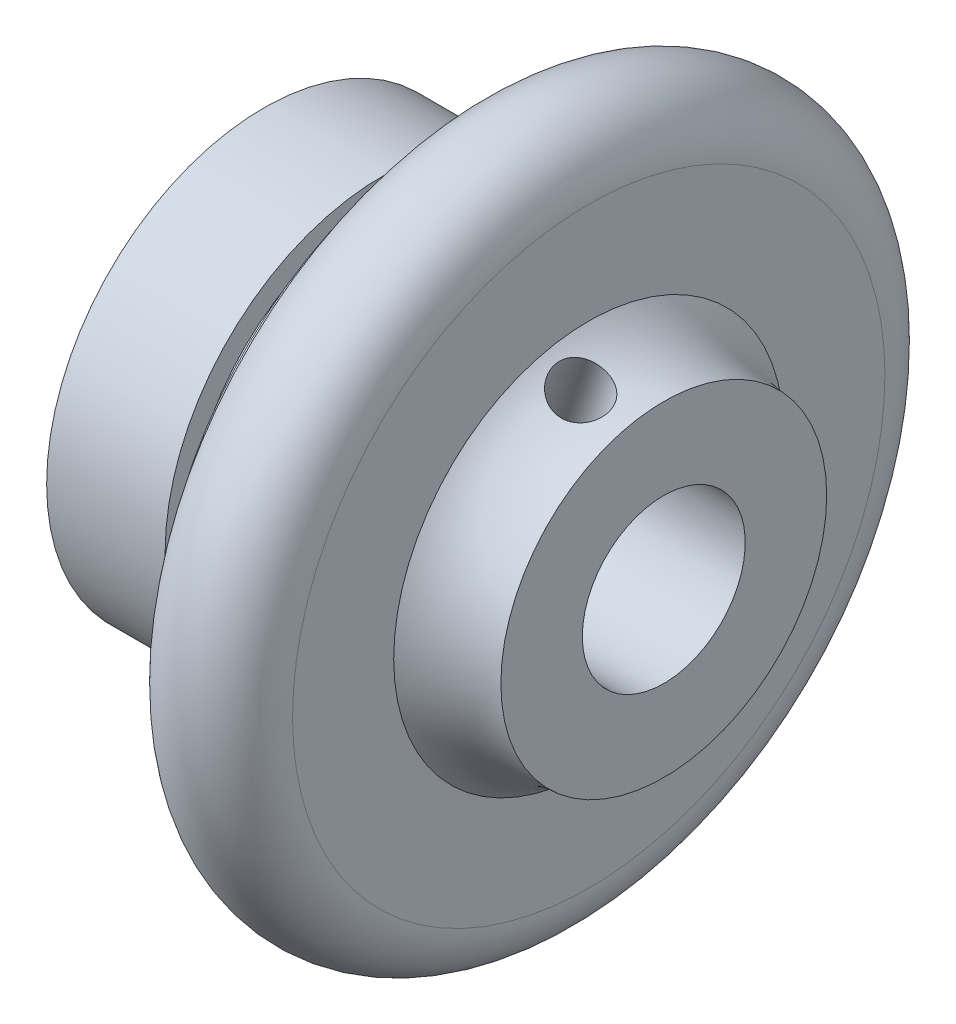
ISO-10303-21;
HEADER;
FILE_DESCRIPTION(('STEP AP214'),'2;1');
FILE_NAME('part.step','',(''),(''),'','','');
FILE_SCHEMA(('AUTOMOTIVE_DESIGN { 1 0 10303 214 1 1 1 1 }'));
ENDSEC;
DATA;
#1=APPLICATION_CONTEXT('core data for automotive mechanical design processes');
#2=APPLICATION_PROTOCOL_DEFINITION('international standard','automotive_design',2000,#1);
#3=PRODUCT_CONTEXT('',#1,'mechanical');
#4=PRODUCT('Part','Part','',(#3));
#5=PRODUCT_RELATED_PRODUCT_CATEGORY('part','',(#4));
#6=PRODUCT_DEFINITION_FORMATION('','',#4);
#7=PRODUCT_DEFINITION_CONTEXT('part definition',#1,'design');
#8=PRODUCT_DEFINITION('design','',#6,#7);
#9=PRODUCT_DEFINITION_SHAPE('','',#8);
#10=(LENGTH_UNIT() NAMED_UNIT(*) SI_UNIT(.MILLI.,.METRE.));
#11=(NAMED_UNIT(*) PLANE_ANGLE_UNIT() SI_UNIT($,.RADIAN.));
#12=(NAMED_UNIT(*) SI_UNIT($,.STERADIAN.) SOLID_ANGLE_UNIT());
#13=UNCERTAINTY_MEASURE_WITH_UNIT(LENGTH_MEASURE(1.E-05),#10,'distance_accuracy_value','');
#14=(GEOMETRIC_REPRESENTATION_CONTEXT(3) GLOBAL_UNCERTAINTY_ASSIGNED_CONTEXT((#13)) GLOBAL_UNIT_ASSIGNED_CONTEXT((#10,
#11,#12)) REPRESENTATION_CONTEXT('',''));
#15=CARTESIAN_POINT('',(0.,0.,0.));
#16=DIRECTION('',(0.,0.,1.));
#17=DIRECTION('',(1.,0.,0.));
#18=AXIS2_PLACEMENT_3D('',#15,#16,#17);
#19=CARTESIAN_POINT('',(0.,14.67,0.));
#20=DIRECTION('',(1.,0.,0.));
#21=DIRECTION('',(0.,0.,-1.));
#22=AXIS2_PLACEMENT_3D('',#19,#20,#21);
#23=PLANE('',#22);
#24=CARTESIAN_POINT('',(0.,0.,0.));
#25=DIRECTION('',(-1.,0.,0.));
#26=DIRECTION('',(0.,0.,1.));
#27=AXIS2_PLACEMENT_3D('',#24,#25,#26);
#28=CIRCLE('',#27,5.5);
#29=CARTESIAN_POINT('',(0.,0.,5.5));
#30=VERTEX_POINT('',#29);
#31=EDGE_CURVE('E90',#30,#30,#28,.T.);
#32=ORIENTED_EDGE('',*,*,#31,.F.);
#33=EDGE_LOOP('',(#32));
#34=FACE_BOUND('',#33,.T.);
#35=CARTESIAN_POINT('',(0.,0.,0.));
#36=DIRECTION('',(-1.,0.,0.));
#37=DIRECTION('',(0.,0.,1.));
#38=AXIS2_PLACEMENT_3D('',#35,#36,#37);
#39=CIRCLE('',#38,14.67);
#40=CARTESIAN_POINT('',(0.,0.,14.67));
#41=VERTEX_POINT('',#40);
#42=EDGE_CURVE('E10',#41,#41,#39,.T.);
#43=ORIENTED_EDGE('',*,*,#42,.T.);
#44=EDGE_LOOP('',(#43));
#45=FACE_BOUND('',#44,.T.);
#46=ADVANCED_FACE('F43',(#34,#45),#23,.F.);
#47=CARTESIAN_POINT('',(0.,0.,0.));
#48=DIRECTION('',(-1.,0.,0.));
#49=DIRECTION('',(0.,0.,1.));
#50=AXIS2_PLACEMENT_3D('',#47,#48,#49);
#51=CYLINDRICAL_SURFACE('',#50,14.67);
#52=ORIENTED_EDGE('',*,*,#42,.F.);
#53=EDGE_LOOP('',(#52));
#54=FACE_BOUND('',#53,.T.);
#55=CARTESIAN_POINT('',(8.,0.,0.));
#56=DIRECTION('',(-1.,0.,0.));
#57=DIRECTION('',(0.,0.,1.));
#58=AXIS2_PLACEMENT_3D('',#55,#56,#57);
#59=CIRCLE('',#58,14.67);
#60=CARTESIAN_POINT('',(8.,0.,14.67));
#61=VERTEX_POINT('',#60);
#62=EDGE_CURVE('E50',#61,#61,#59,.T.);
#63=ORIENTED_EDGE('',*,*,#62,.T.);
#64=EDGE_LOOP('',(#63));
#65=FACE_BOUND('',#64,.T.);
#66=ADVANCED_FACE('F123',(#54,#65),#51,.T.);
#67=CARTESIAN_POINT('',(8.,13.17,0.));
#68=DIRECTION('',(-1.,0.,0.));
#69=DIRECTION('',(0.,0.,1.));
#70=AXIS2_PLACEMENT_3D('',#67,#68,#69);
#71=PLANE('',#70);
#72=ORIENTED_EDGE('',*,*,#62,.F.);
#73=EDGE_LOOP('',(#72));
#74=FACE_BOUND('',#73,.T.);
#75=CARTESIAN_POINT('',(8.,0.,0.));
#76=DIRECTION('',(-1.,0.,0.));
#77=DIRECTION('',(0.,0.,1.));
#78=AXIS2_PLACEMENT_3D('',#75,#76,#77);
#79=CIRCLE('',#78,13.17);
#80=CARTESIAN_POINT('',(8.,0.,13.17));
#81=VERTEX_POINT('',#80);
#82=EDGE_CURVE('E55',#81,#81,#79,.T.);
#83=ORIENTED_EDGE('',*,*,#82,.T.);
#84=EDGE_LOOP('',(#83));
#85=FACE_BOUND('',#84,.T.);
#86=ADVANCED_FACE('F128',(#74,#85),#71,.F.);
#87=CARTESIAN_POINT('',(0.,0.,0.));
#88=DIRECTION('',(-1.,0.,0.));
#89=DIRECTION('',(0.,0.,1.));
#90=AXIS2_PLACEMENT_3D('',#87,#88,#89);
#91=CYLINDRICAL_SURFACE('',#90,13.17);
#92=ORIENTED_EDGE('',*,*,#82,.F.);
#93=EDGE_LOOP('',(#92));
#94=FACE_BOUND('',#93,.T.);
#95=CARTESIAN_POINT('',(12.9333344298247,0.,0.));
#96=DIRECTION('',(-1.,0.,0.));
#97=DIRECTION('',(0.,0.,1.));
#98=AXIS2_PLACEMENT_3D('',#95,#96,#97);
#99=CIRCLE('',#98,13.17);
#100=CARTESIAN_POINT('',(12.9333344298247,0.,13.17));
#101=VERTEX_POINT('',#100);
#102=EDGE_CURVE('E60',#101,#101,#99,.T.);
#103=ORIENTED_EDGE('',*,*,#102,.T.);
#104=EDGE_LOOP('',(#103));
#105=FACE_BOUND('',#104,.T.);
#106=ADVANCED_FACE('F135',(#94,#105),#91,.T.);
#107=CARTESIAN_POINT('',(12.9333344298247,20.,0.));
#108=DIRECTION('',(1.,0.,0.));
#109=DIRECTION('',(0.,0.,-1.));
#110=AXIS2_PLACEMENT_3D('',#107,#108,#109);
#111=PLANE('',#110);
#112=ORIENTED_EDGE('',*,*,#102,.F.);
#113=EDGE_LOOP('',(#112));
#114=FACE_BOUND('',#113,.T.);
#115=CARTESIAN_POINT('',(12.9333344298247,0.,0.));
#116=DIRECTION('',(-1.,0.,0.));
#117=DIRECTION('',(0.,0.,1.));
#118=AXIS2_PLACEMENT_3D('',#115,#116,#117);
#119=CIRCLE('',#118,20.);
#120=CARTESIAN_POINT('',(12.9333344298247,0.,20.));
#121=VERTEX_POINT('',#120);
#122=EDGE_CURVE('E66',#121,#121,#119,.T.);
#123=ORIENTED_EDGE('',*,*,#122,.T.);
#124=EDGE_LOOP('',(#123));
#125=FACE_BOUND('',#124,.T.);
#126=ADVANCED_FACE('F141',(#114,#125),#111,.F.);
#127=CARTESIAN_POINT('',(0.,0.,0.));
#128=DIRECTION('',(-1.,0.,0.));
#129=DIRECTION('',(0.,0.,1.));
#130=AXIS2_PLACEMENT_3D('',#127,#128,#129);
#131=CYLINDRICAL_SURFACE('',#130,20.);
#132=ORIENTED_EDGE('',*,*,#122,.F.);
#133=EDGE_LOOP('',(#132));
#134=FACE_BOUND('',#133,.T.);
#135=CARTESIAN_POINT('',(13.9333344298247,0.,0.));
#136=DIRECTION('',(-1.,0.,0.));
#137=DIRECTION('',(0.,0.,1.));
#138=AXIS2_PLACEMENT_3D('',#135,#136,#137);
#139=CIRCLE('',#138,20.);
#140=CARTESIAN_POINT('',(13.9333344298247,0.,20.));
#141=VERTEX_POINT('',#140);
#142=EDGE_CURVE('E70',#141,#141,#139,.T.);
#143=ORIENTED_EDGE('',*,*,#142,.T.);
#144=EDGE_LOOP('',(#143));
#145=FACE_BOUND('',#144,.T.);
#146=ADVANCED_FACE('F145',(#134,#145),#131,.T.);
#147=CARTESIAN_POINT('',(17.9333344298247,0.,0.));
#148=DIRECTION('',(-1.,0.,0.));
#149=DIRECTION('',(0.,0.,1.));
#150=AXIS2_PLACEMENT_3D('',#147,#148,#149);
#151=TOROIDAL_SURFACE('',#150,20.,4.);
#152=ORIENTED_EDGE('',*,*,#142,.F.);
#153=EDGE_LOOP('',(#152));
#154=FACE_BOUND('',#153,.T.);
#155=CARTESIAN_POINT('',(21.9333344298247,0.,0.));
#156=DIRECTION('',(-1.,0.,0.));
#157=DIRECTION('',(0.,0.,1.));
#158=AXIS2_PLACEMENT_3D('',#155,#156,#157);
#159=CIRCLE('',#158,20.);
#160=CARTESIAN_POINT('',(21.9333344298247,0.,20.));
#161=VERTEX_POINT('',#160);
#162=EDGE_CURVE('E74',#161,#161,#159,.T.);
#163=ORIENTED_EDGE('',*,*,#162,.T.);
#164=EDGE_LOOP('',(#163));
#165=FACE_BOUND('',#164,.T.);
#166=ADVANCED_FACE('F149',(#154,#165),#151,.T.);
#167=CARTESIAN_POINT('',(21.9333344298247,13.17,0.));
#168=DIRECTION('',(-1.,0.,0.));
#169=DIRECTION('',(0.,0.,1.));
#170=AXIS2_PLACEMENT_3D('',#167,#168,#169);
#171=PLANE('',#170);
#172=ORIENTED_EDGE('',*,*,#162,.F.);
#173=EDGE_LOOP('',(#172));
#174=FACE_BOUND('',#173,.T.);
#175=CARTESIAN_POINT('',(21.9333344298247,0.,0.));
#176=DIRECTION('',(-1.,0.,0.));
#177=DIRECTION('',(0.,0.,1.));
#178=AXIS2_PLACEMENT_3D('',#175,#176,#177);
#179=CIRCLE('',#178,13.17);
#180=CARTESIAN_POINT('',(21.9333344298247,0.,13.17));
#181=VERTEX_POINT('',#180);
#182=EDGE_CURVE('E78',#181,#181,#179,.T.);
#183=ORIENTED_EDGE('',*,*,#182,.T.);
#184=EDGE_LOOP('',(#183));
#185=FACE_BOUND('',#184,.T.);
#186=ADVANCED_FACE('F153',(#174,#185),#171,.F.);
#187=CARTESIAN_POINT('',(27.,0.,0.));
#188=DIRECTION('',(-1.,0.,0.));
#189=DIRECTION('',(0.,0.,1.));
#190=AXIS2_PLACEMENT_3D('',#187,#188,#189);
#191=TOROIDAL_SURFACE('',#190,18.,7.);
#192=CARTESIAN_POINT('',(24.3192099735375,11.5003357512028,0.876313995896168));
#193=CARTESIAN_POINT('',(24.4079678325172,11.4621925546826,0.892608350885709));
#194=CARTESIAN_POINT('',(24.4961201380341,11.4257808008987,0.917437827083082));
#195=CARTESIAN_POINT('',(24.6680971522644,11.3567832450294,0.982987617116957));
#196=CARTESIAN_POINT('',(24.7519069390884,11.3242102006067,1.02375907661811));
#197=CARTESIAN_POINT('',(24.912073337954,11.2627315250046,1.11940485584437));
#198=CARTESIAN_POINT('',(24.9884558742276,11.2338130235794,1.17422750056089));
#199=CARTESIAN_POINT('',(25.1316658109852,11.1788034088174,1.2962558779455));
#200=CARTESIAN_POINT('',(25.1984976218005,11.1527109918084,1.36345586198132));
#201=CARTESIAN_POINT('',(25.3228220257063,11.1014508630979,1.51129712942603));
#202=CARTESIAN_POINT('',(25.3798422450903,11.0763602246379,1.59236405018528));
#203=CARTESIAN_POINT('',(25.4787111723171,11.0273285429301,1.76361779257921));
#204=CARTESIAN_POINT('',(25.5205619872188,11.0033873404247,1.85380334539136));
#205=CARTESIAN_POINT('',(25.5859696132107,10.9566962613476,2.03797360860249));
#206=CARTESIAN_POINT('',(25.6099949915885,10.9339317071298,2.13178720666539));
#207=CARTESIAN_POINT('',(25.6401415655192,10.8888718848236,2.32233931708526));
#208=CARTESIAN_POINT('',(25.6462727896962,10.8665763608301,2.41907616040656));
#209=CARTESIAN_POINT('',(25.6404759450763,10.8245227696286,2.6054506540081));
#210=CARTESIAN_POINT('',(25.6297754398457,10.8046961096233,2.69511367449045));
#211=CARTESIAN_POINT('',(25.5931711989295,10.7667902196044,2.87165212674668));
#212=CARTESIAN_POINT('',(25.5672661239231,10.7487111436931,2.95852731223822));
#213=CARTESIAN_POINT('',(25.5014492961662,10.7154055807434,3.12766144019478));
#214=CARTESIAN_POINT('',(25.4614949279849,10.7001879913904,3.20990544439809));
#215=CARTESIAN_POINT('',(25.369287119335,10.6739836874561,3.36791789229407));
#216=CARTESIAN_POINT('',(25.3170294035982,10.6629984470724,3.44368407251578));
#217=CARTESIAN_POINT('',(25.1979912577221,10.6460555591918,3.59256008379043));
#218=CARTESIAN_POINT('',(25.1304470994996,10.6405065986381,3.66510679084126));
#219=CARTESIAN_POINT('',(24.985677282957,10.6374725237681,3.80003168640034));
#220=CARTESIAN_POINT('',(24.9084490884605,10.6399895261229,3.86240720126941));
#221=CARTESIAN_POINT('',(24.7442958141322,10.654769861416,3.97740285953517));
#222=CARTESIAN_POINT('',(24.6571472046958,10.6673273783088,4.02966848167621));
#223=CARTESIAN_POINT('',(24.478183393481,10.7036654243648,4.12051032972792));
#224=CARTESIAN_POINT('',(24.3863705061211,10.7274404350086,4.15909327059248));
#225=CARTESIAN_POINT('',(24.206287803063,10.7848794131836,4.21960840401881));
#226=CARTESIAN_POINT('',(24.1180898987937,10.8179489027131,4.24231832463418));
#227=CARTESIAN_POINT('',(23.9433106971808,10.8936518373744,4.27352504164133));
#228=CARTESIAN_POINT('',(23.8567290046582,10.9362829105297,4.28202535864743));
#229=CARTESIAN_POINT('',(23.6917099852226,11.0273557044117,4.28450051125126));
#230=CARTESIAN_POINT('',(23.6130811696909,11.0754362920253,4.27913065708711));
#231=CARTESIAN_POINT('',(23.4614490836116,11.1769591840981,4.25544059999961));
#232=CARTESIAN_POINT('',(23.3884466101374,11.2304022457895,4.23711856589123));
#233=CARTESIAN_POINT('',(23.2473740412211,11.342094451692,4.18729751789645));
#234=CARTESIAN_POINT('',(23.1795095720259,11.4004382474834,4.15543020677094));
#235=CARTESIAN_POINT('',(23.0521363852276,11.5180944226067,4.07921187757863));
#236=CARTESIAN_POINT('',(22.9926304680717,11.5774071191644,4.03485669045966));
#237=CARTESIAN_POINT('',(22.8794482178482,11.6980526746859,3.93149828956711));
#238=CARTESIAN_POINT('',(22.8263259471701,11.7592971005348,3.87178306668003));
#239=CARTESIAN_POINT('',(22.7309979808468,11.8773212305484,3.74038979335246));
#240=CARTESIAN_POINT('',(22.6887935426054,11.9341004199294,3.66871036656046));
#241=CARTESIAN_POINT('',(22.6156576796011,12.0409088125033,3.51416350490275));
#242=CARTESIAN_POINT('',(22.5848278605584,12.0908747766155,3.43120388165436));
#243=CARTESIAN_POINT('',(22.5356219924884,12.1808414884344,3.25664294018726));
#244=CARTESIAN_POINT('',(22.5172404311852,12.220846641969,3.16504546743624));
#245=CARTESIAN_POINT('',(22.4940045488793,12.2870690858349,2.98081685951984));
#246=CARTESIAN_POINT('',(22.4884973003749,12.3138945201636,2.88848644098202));
#247=CARTESIAN_POINT('',(22.4892231109159,12.3556941342781,2.70123661215915));
#248=CARTESIAN_POINT('',(22.4954538726182,12.3706706323028,2.60631771207051));
#249=CARTESIAN_POINT('',(22.5190676659703,12.3882784722999,2.42014874051018));
#250=CARTESIAN_POINT('',(22.5360540029778,12.3913223126796,2.32888621136));
#251=CARTESIAN_POINT('',(22.5804386963254,12.3867661538078,2.149212845324));
#252=CARTESIAN_POINT('',(22.6078386244432,12.3791645473183,2.06080244111076));
#253=CARTESIAN_POINT('',(22.6735809186911,12.3540117195812,1.8864385748704));
#254=CARTESIAN_POINT('',(22.7122383263596,12.3361571522432,1.8006480992241));
#255=CARTESIAN_POINT('',(22.799543763768,12.291831330957,1.63670932686046));
#256=CARTESIAN_POINT('',(22.8481949995584,12.2653573102634,1.55856349447378));
#257=CARTESIAN_POINT('',(22.9578047078621,12.2039043707105,1.40789058026166));
#258=CARTESIAN_POINT('',(23.0192894057827,12.1685405795182,1.33590180744785));
#259=CARTESIAN_POINT('',(23.1518827434043,12.0923460373976,1.204794851973));
#260=CARTESIAN_POINT('',(23.2229928401035,12.0515144588194,1.14567862137172));
#261=CARTESIAN_POINT('',(23.3769567772985,11.964806943065,1.04015233128826));
#262=CARTESIAN_POINT('',(23.4601848418855,11.9187893987801,0.994400241568564));
#263=CARTESIAN_POINT('',(23.6339409175231,11.8258470985068,0.921250190897974));
#264=CARTESIAN_POINT('',(23.7244676245815,11.7789225057077,0.893848959445917));
#265=CARTESIAN_POINT('',(23.8960764728308,11.693488066955,0.86139552862231));
#266=CARTESIAN_POINT('',(23.9765522805357,11.6547674013841,0.853618596540625));
#267=CARTESIAN_POINT('',(24.1384930714697,11.5796257192761,0.852595926853245));
#268=CARTESIAN_POINT('',(24.2199547054287,11.5431986417734,0.859310080619833));
#269=CARTESIAN_POINT('',(24.3068747736238,11.5056438352743,0.874091203331744));
#270=CARTESIAN_POINT('',(24.3130438348674,11.5029856150207,0.875182003151397));
#271=CARTESIAN_POINT('',(24.3192099735375,11.5003357512028,0.876313995896168));
#272=B_SPLINE_CURVE_WITH_KNOTS('',3,(#192,#193,#194,#195,#196,#197,#198,#199,#200,#201,#202,
#203,#204,#205,#206,#207,#208,#209,#210,#211,#212,#213,#214,#215,#216,#217,#218,#219,#220,#221,
#222,#223,#224,#225,#226,#227,#228,#229,#230,#231,#232,#233,#234,#235,#236,#237,#238,#239,#240,
#241,#242,#243,#244,#245,#246,#247,#248,#249,#250,#251,#252,#253,#254,#255,#256,#257,#258,#259,
#260,#261,#262,#263,#264,#265,#266,#267,#268,#269,#270,#271),.UNSPECIFIED.,.T.,.F.,(4,2,2,2,2,2,
2,2,2,2,2,2,2,2,2,2,2,2,2,2,2,2,2,2,2,2,2,2,2,2,2,2,2,2,2,2,2,2,2,4),(0.,0.293898774536742,
0.588748286403763,0.882528633408766,1.1761728771747,1.48140000078492,1.78658471151266,
2.0834315506839,2.38011199263305,2.6561376578781,2.93218764097022,3.20908228840412,
3.48607329584594,3.78257710030666,4.07915871970584,4.38476327179776,4.69021763624772,
4.97939486279478,5.26850043129352,5.54419931486007,5.8199371846562,6.10370727825745,
6.3875722204967,6.68825087753751,6.98896414825701,7.29230203963511,7.59550552044292,
7.88296291566721,8.17036405607151,8.44773759303761,8.72515301207643,9.01123309745528,
9.29740510192993,9.59917296337483,9.90098655465968,10.2158171080337,10.5305915371721,
10.7983966002054,11.0654613794421,11.0858789584555),.UNSPECIFIED.);
#273=CARTESIAN_POINT('',(24.3192099735375,11.5003357512028,0.876313995896168));
#274=VERTEX_POINT('',#273);
#275=EDGE_CURVE('E94',#274,#274,#272,.T.);
#276=ORIENTED_EDGE('',*,*,#275,.T.);
#277=EDGE_LOOP('',(#276));
#278=FACE_BOUND('',#277,.T.);
#279=ORIENTED_EDGE('',*,*,#182,.F.);
#280=EDGE_LOOP('',(#279));
#281=FACE_BOUND('',#280,.T.);
#282=CARTESIAN_POINT('',(27.,0.,0.));
#283=DIRECTION('',(-1.,0.,0.));
#284=DIRECTION('',(0.,0.,1.));
#285=AXIS2_PLACEMENT_3D('',#282,#283,#284);
#286=CIRCLE('',#285,11.);
#287=CARTESIAN_POINT('',(27.,0.,11.));
#288=VERTEX_POINT('',#287);
#289=EDGE_CURVE('E82',#288,#288,#286,.T.);
#290=ORIENTED_EDGE('',*,*,#289,.T.);
#291=EDGE_LOOP('',(#290));
#292=FACE_BOUND('',#291,.T.);
#293=ADVANCED_FACE('F157',(#278,#281,#292),#191,.F.);
#294=CARTESIAN_POINT('',(27.,5.5,0.));
#295=DIRECTION('',(-1.,0.,0.));
#296=DIRECTION('',(0.,0.,1.));
#297=AXIS2_PLACEMENT_3D('',#294,#295,#296);
#298=PLANE('',#297);
#299=ORIENTED_EDGE('',*,*,#289,.F.);
#300=EDGE_LOOP('',(#299));
#301=FACE_BOUND('',#300,.T.);
#302=CARTESIAN_POINT('',(27.,0.,0.));
#303=DIRECTION('',(-1.,0.,0.));
#304=DIRECTION('',(0.,0.,1.));
#305=AXIS2_PLACEMENT_3D('',#302,#303,#304);
#306=CIRCLE('',#305,5.5);
#307=CARTESIAN_POINT('',(27.,0.,5.5));
#308=VERTEX_POINT('',#307);
#309=EDGE_CURVE('E86',#308,#308,#306,.T.);
#310=ORIENTED_EDGE('',*,*,#309,.T.);
#311=EDGE_LOOP('',(#310));
#312=FACE_BOUND('',#311,.T.);
#313=ADVANCED_FACE('F118',(#301,#312),#298,.F.);
#314=CARTESIAN_POINT('',(0.,0.,0.));
#315=DIRECTION('',(-1.,0.,0.));
#316=DIRECTION('',(0.,0.,1.));
#317=AXIS2_PLACEMENT_3D('',#314,#315,#316);
#318=CYLINDRICAL_SURFACE('',#317,5.5);
#319=CARTESIAN_POINT('',(19.0651782265899,5.39855327092759,1.05148589194389));
#320=CARTESIAN_POINT('',(19.0560458594457,5.38000487313386,1.14671466604012));
#321=CARTESIAN_POINT('',(19.0546862781566,5.35877444840996,1.24217122390504));
#322=CARTESIAN_POINT('',(19.0675398981166,5.31151495613832,1.43082784524804));
#323=CARTESIAN_POINT('',(19.0817544236541,5.2854854806771,1.52402771614804));
#324=CARTESIAN_POINT('',(19.1255064830863,5.22971348584916,1.70561478656512));
#325=CARTESIAN_POINT('',(19.1550463600406,5.1999703992447,1.79400124788663));
#326=CARTESIAN_POINT('',(19.228884282183,5.1383402313307,1.96356888532575));
#327=CARTESIAN_POINT('',(19.2731815607673,5.10645326145829,2.04475043544009));
#328=CARTESIAN_POINT('',(19.3753757792694,5.04261237504257,2.1974738333979));
#329=CARTESIAN_POINT('',(19.4332153109658,5.01065929041586,2.26905442052826));
#330=CARTESIAN_POINT('',(19.561188904153,4.94869299009699,2.40120276343472));
#331=CARTESIAN_POINT('',(19.6313209686479,4.91867946039478,2.46177230477052));
#332=CARTESIAN_POINT('',(19.7812252867248,4.86296671518026,2.5700661446149));
#333=CARTESIAN_POINT('',(19.8608958628985,4.83722794364722,2.61791100456996));
#334=CARTESIAN_POINT('',(20.0281063673691,4.79143242107733,2.70082000768559));
#335=CARTESIAN_POINT('',(20.1156462757811,4.77137565568318,2.73588418314046));
#336=CARTESIAN_POINT('',(20.2973835220567,4.73785707732199,2.79353651847866));
#337=CARTESIAN_POINT('',(20.391660200338,4.72449723672827,2.81593240204621));
#338=CARTESIAN_POINT('',(20.5830954781174,4.70532500219392,2.84785189444022));
#339=CARTESIAN_POINT('',(20.680255077634,4.69951525926526,2.85737098197707));
#340=CARTESIAN_POINT('',(20.8830945308833,4.69515788202194,2.86452706534421));
#341=CARTESIAN_POINT('',(20.9888224276876,4.69724181857553,2.86113061095233));
#342=CARTESIAN_POINT('',(21.1985282047162,4.70937985089773,2.84110305311702));
#343=CARTESIAN_POINT('',(21.3025053176089,4.71943735299659,2.82446629336519));
#344=CARTESIAN_POINT('',(21.5206862663653,4.74833204634184,2.77565490129545));
#345=CARTESIAN_POINT('',(21.6343534992878,4.76817868085858,2.74167222779425));
#346=CARTESIAN_POINT('',(21.8544780700586,4.81513462895491,2.65833758525617));
#347=CARTESIAN_POINT('',(21.9609249486563,4.84225420786739,2.60896387656099));
#348=CARTESIAN_POINT('',(22.1726994560102,4.90455274387348,2.49003495624153));
#349=CARTESIAN_POINT('',(22.2771080700626,4.94023028093704,2.41908832820146));
#350=CARTESIAN_POINT('',(22.4693854648911,5.01538220943666,2.25913571138825));
#351=CARTESIAN_POINT('',(22.5572931073354,5.05484734043861,2.17017320700096));
#352=CARTESIAN_POINT('',(22.6849671291223,5.12111541462281,2.00726839907921));
#353=CARTESIAN_POINT('',(22.731019974988,5.14776309817521,1.93817477876228));
#354=CARTESIAN_POINT('',(22.8108155926954,5.20014816494629,1.79287501048071));
#355=CARTESIAN_POINT('',(22.844570656126,5.2258864337512,1.71667606049783));
#356=CARTESIAN_POINT('',(22.897775346811,5.27535988335047,1.55804926403013));
#357=CARTESIAN_POINT('',(22.9171149275284,5.29907845489668,1.4755786930235));
#358=CARTESIAN_POINT('',(22.9394182720477,5.3430187699024,1.30754305952433));
#359=CARTESIAN_POINT('',(22.9423914331607,5.36324251356759,1.22197980121507));
#360=CARTESIAN_POINT('',(22.9323571473396,5.39723370557598,1.06105550322628));
#361=CARTESIAN_POINT('',(22.9211805873506,5.41147990661776,0.985673272681311));
#362=CARTESIAN_POINT('',(22.8866836026576,5.43643567654267,0.837161745151624));
#363=CARTESIAN_POINT('',(22.8633620261652,5.44714490983539,0.764032662543953));
#364=CARTESIAN_POINT('',(22.805424287911,5.46538524781689,0.620412250939088));
#365=CARTESIAN_POINT('',(22.7706052361902,5.4728532327117,0.54999573619796));
#366=CARTESIAN_POINT('',(22.6914956038761,5.48478585936033,0.414444796638014));
#367=CARTESIAN_POINT('',(22.647198477744,5.48924841669346,0.349314065263475));
#368=CARTESIAN_POINT('',(22.5295822129023,5.49717022797636,0.19781592917447));
#369=CARTESIAN_POINT('',(22.4520493200387,5.49933404600943,0.11464088425668));
#370=CARTESIAN_POINT('',(22.2846434953054,5.5004005360153,-0.0382262989055819));
#371=CARTESIAN_POINT('',(22.1947516528439,5.49929815616823,-0.107897373106987));
#372=CARTESIAN_POINT('',(22.0044487237346,5.49539252049132,-0.233829813910539));
#373=CARTESIAN_POINT('',(21.9039193019347,5.4925679956834,-0.289911039788888));
#374=CARTESIAN_POINT('',(21.6957408557128,5.48660231714336,-0.386712372384339));
#375=CARTESIAN_POINT('',(21.5880910770582,5.48346112984985,-0.427430848710749));
#376=CARTESIAN_POINT('',(21.3529903570216,5.47764785457267,-0.496752128491526));
#377=CARTESIAN_POINT('',(21.2248245199365,5.47509582140932,-0.522986377422264));
#378=CARTESIAN_POINT('',(20.9657584604059,5.47225390226501,-0.55197130607999));
#379=CARTESIAN_POINT('',(20.8348590570359,5.47196334814439,-0.554728921852176));
#380=CARTESIAN_POINT('',(20.5841084868485,5.47390287719912,-0.535231463817905));
#381=CARTESIAN_POINT('',(20.4641265542015,5.47595753054025,-0.514717826832071));
#382=CARTESIAN_POINT('',(20.2306254841642,5.48162014336221,-0.45042026090064));
#383=CARTESIAN_POINT('',(20.1170981588839,5.48522608285355,-0.406666576389923));
#384=CARTESIAN_POINT('',(19.9169615425506,5.49176754635179,-0.304448482089565));
#385=CARTESIAN_POINT('',(19.8288212952691,5.49472541109154,-0.248966567774249));
#386=CARTESIAN_POINT('',(19.6639821245473,5.49898483571873,-0.1229675925361));
#387=CARTESIAN_POINT('',(19.5872798267287,5.50028688495502,-0.052454980883256));
#388=CARTESIAN_POINT('',(19.4525789075242,5.49962901997119,0.0958113348502743));
#389=CARTESIAN_POINT('',(19.3936544435473,5.49788816015321,0.172728712746273));
#390=CARTESIAN_POINT('',(19.2892344574981,5.49038753748405,0.335008620001468));
#391=CARTESIAN_POINT('',(19.2437371814745,5.48462829987181,0.420370044394809));
#392=CARTESIAN_POINT('',(19.1678452916816,5.46838625807319,0.595245472318046));
#393=CARTESIAN_POINT('',(19.1371876514541,5.45799251624793,0.684653874377945));
#394=CARTESIAN_POINT('',(19.0902947350959,5.43209612419657,0.866464884199818));
#395=CARTESIAN_POINT('',(19.0740602452116,5.41659319551747,0.958867654908695));
#396=CARTESIAN_POINT('',(19.0651782265899,5.39855327092759,1.05148589194389));
#397=B_SPLINE_CURVE_WITH_KNOTS('',3,(#319,#320,#321,#322,#323,#324,#325,#326,#327,#328,#329,
#330,#331,#332,#333,#334,#335,#336,#337,#338,#339,#340,#341,#342,#343,#344,#345,#346,#347,#348,
#349,#350,#351,#352,#353,#354,#355,#356,#357,#358,#359,#360,#361,#362,#363,#364,#365,#366,#367,
#368,#369,#370,#371,#372,#373,#374,#375,#376,#377,#378,#379,#380,#381,#382,#383,#384,#385,#386,
#387,#388,#389,#390,#391,#392,#393,#394,#395,#396),.UNSPECIFIED.,.T.,.F.,(4,2,2,2,2,2,2,2,2,2,2,
2,2,2,2,2,2,2,2,2,2,2,2,2,2,2,2,2,2,2,2,2,2,2,2,2,2,2,4),(0.,0.29200605662909,0.584036944871181,
0.876112494241877,1.16817287350648,1.45901687989166,1.74981368063561,2.03774831869603,
2.32568222919693,2.6178765138885,2.9101733669805,3.22633226232599,3.54262629449238,
3.90201113167331,4.26190591368124,4.6534024114492,5.04396499323201,5.30459883110765,
5.56497144706443,5.82731192142646,6.0895017487629,6.32098353878065,6.5524872856757,
6.78831652187798,7.0243091499754,7.36366050502676,7.70353700780739,8.04769858614855,
8.39189667879358,8.78242505482683,9.172838047343,9.53585775108726,9.89840617689716,
10.2093215495769,10.5201450149982,10.809503712997,11.0988245962365,11.3828103168586,
11.6668115173913),.UNSPECIFIED.);
#398=CARTESIAN_POINT('',(19.0651782265899,5.39855327092759,1.05148589194389));
#399=VERTEX_POINT('',#398);
#400=EDGE_CURVE('E103',#399,#399,#397,.T.);
#401=ORIENTED_EDGE('',*,*,#400,.T.);
#402=EDGE_LOOP('',(#401));
#403=FACE_BOUND('',#402,.T.);
#404=ORIENTED_EDGE('',*,*,#309,.F.);
#405=EDGE_LOOP('',(#404));
#406=FACE_BOUND('',#405,.T.);
#407=ORIENTED_EDGE('',*,*,#31,.T.);
#408=EDGE_LOOP('',(#407));
#409=FACE_BOUND('',#408,.T.);
#410=ADVANCED_FACE('F112',(#403,#406,#409),#318,.F.);
#411=CARTESIAN_POINT('',(23.9702213424456,11.3988440838131,2.59121808401593));
#412=DIRECTION('',(0.432825522507765,0.879051007822782,0.199828408169687));
#413=DIRECTION('',(-0.897145620837205,0.441734914867079,0.));
#414=AXIS2_PLACEMENT_3D('',#411,#412,#413);
#415=CYLINDRICAL_SURFACE('',#414,1.75);
#416=ORIENTED_EDGE('',*,*,#275,.F.);
#417=EDGE_LOOP('',(#416));
#418=FACE_BOUND('',#417,.T.);
#419=ORIENTED_EDGE('',*,*,#400,.F.);
#420=EDGE_LOOP('',(#419));
#421=FACE_BOUND('',#420,.T.);
#422=ADVANCED_FACE('F109',(#418,#421),#415,.F.);
#423=CLOSED_SHELL('',(#46,#66,#86,#106,#126,#146,#166,#186,#293,#313,#410,#422));
#424=MANIFOLD_SOLID_BREP('B2',#423);
#425=ADVANCED_BREP_SHAPE_REPRESENTATION('',(#18,#424),#14);
#426=SHAPE_DEFINITION_REPRESENTATION(#9,#425);
ENDSEC;
END-ISO-10303-21;
